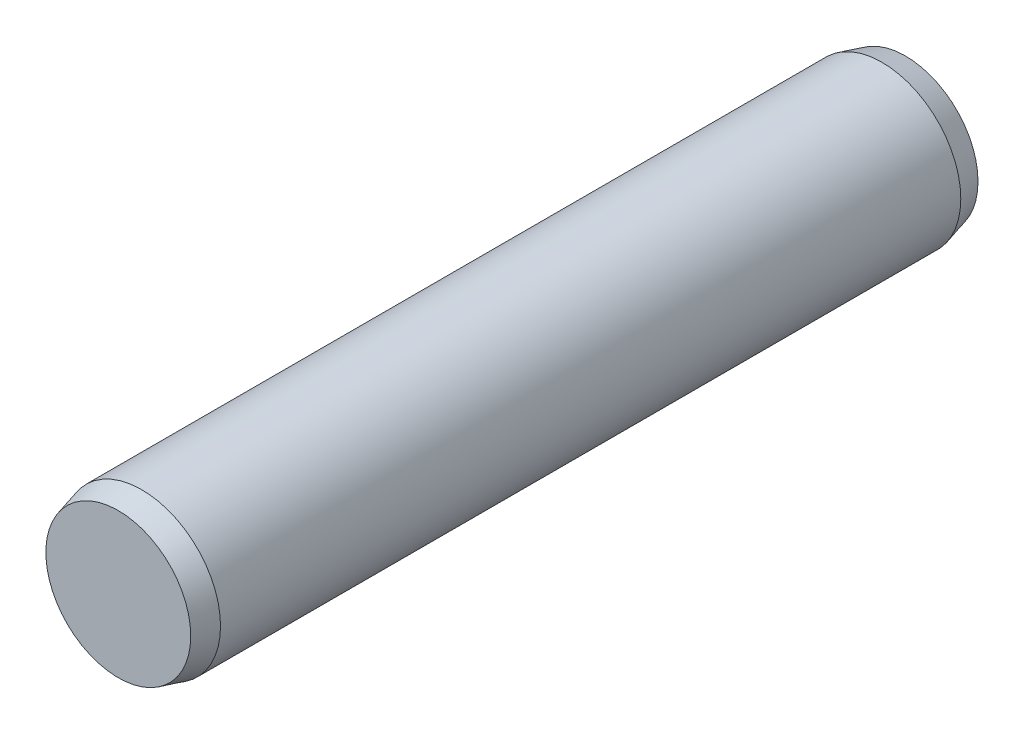
ISO-10303-21;
HEADER;
FILE_DESCRIPTION(('STEP AP214'),'2;1');
FILE_NAME('part.step','',(''),(''),'','','');
FILE_SCHEMA(('AUTOMOTIVE_DESIGN { 1 0 10303 214 1 1 1 1 }'));
ENDSEC;
DATA;
#1=APPLICATION_CONTEXT('core data for automotive mechanical design processes');
#2=APPLICATION_PROTOCOL_DEFINITION('international standard','automotive_design',2000,#1);
#3=PRODUCT_CONTEXT('',#1,'mechanical');
#4=PRODUCT('Part','Part','',(#3));
#5=PRODUCT_RELATED_PRODUCT_CATEGORY('part','',(#4));
#6=PRODUCT_DEFINITION_FORMATION('','',#4);
#7=PRODUCT_DEFINITION_CONTEXT('part definition',#1,'design');
#8=PRODUCT_DEFINITION('design','',#6,#7);
#9=PRODUCT_DEFINITION_SHAPE('','',#8);
#10=(LENGTH_UNIT() NAMED_UNIT(*) SI_UNIT(.MILLI.,.METRE.));
#11=(NAMED_UNIT(*) PLANE_ANGLE_UNIT() SI_UNIT($,.RADIAN.));
#12=(NAMED_UNIT(*) SI_UNIT($,.STERADIAN.) SOLID_ANGLE_UNIT());
#13=UNCERTAINTY_MEASURE_WITH_UNIT(LENGTH_MEASURE(1.E-05),#10,'distance_accuracy_value','');
#14=(GEOMETRIC_REPRESENTATION_CONTEXT(3) GLOBAL_UNCERTAINTY_ASSIGNED_CONTEXT((#13)) GLOBAL_UNIT_ASSIGNED_CONTEXT((#10,
#11,#12)) REPRESENTATION_CONTEXT('',''));
#15=CARTESIAN_POINT('',(0.,0.,0.));
#16=DIRECTION('',(0.,0.,1.));
#17=DIRECTION('',(1.,0.,0.));
#18=AXIS2_PLACEMENT_3D('',#15,#16,#17);
#19=CARTESIAN_POINT('',(0.,0.,12.5));
#20=DIRECTION('',(0.,0.,-1.));
#21=DIRECTION('',(-1.,0.,0.));
#22=AXIS2_PLACEMENT_3D('',#19,#20,#21);
#23=CYLINDRICAL_SURFACE('',#22,2.5);
#24=CARTESIAN_POINT('',(0.,0.,-11.7535898384862));
#25=DIRECTION('',(0.,0.,1.));
#26=DIRECTION('',(1.,0.,0.));
#27=AXIS2_PLACEMENT_3D('',#24,#25,#26);
#28=CIRCLE('',#27,2.5);
#29=CARTESIAN_POINT('',(2.5,0.,-11.7535898384862));
#30=VERTEX_POINT('',#29);
#31=EDGE_CURVE('E40',#30,#30,#28,.T.);
#32=ORIENTED_EDGE('',*,*,#31,.T.);
#33=EDGE_LOOP('',(#32));
#34=FACE_BOUND('',#33,.T.);
#35=CARTESIAN_POINT('',(0.,0.,11.7535898384862));
#36=DIRECTION('',(0.,0.,1.));
#37=DIRECTION('',(1.,0.,0.));
#38=AXIS2_PLACEMENT_3D('',#35,#36,#37);
#39=CIRCLE('',#38,2.5);
#40=CARTESIAN_POINT('',(2.5,0.,11.7535898384862));
#41=VERTEX_POINT('',#40);
#42=EDGE_CURVE('E44',#41,#41,#39,.F.);
#43=ORIENTED_EDGE('',*,*,#42,.T.);
#44=EDGE_LOOP('',(#43));
#45=FACE_BOUND('',#44,.T.);
#46=ADVANCED_FACE('F32',(#34,#45),#23,.T.);
#47=CARTESIAN_POINT('',(0.,0.,12.5));
#48=DIRECTION('',(0.,0.,1.));
#49=DIRECTION('',(1.,0.,0.));
#50=AXIS2_PLACEMENT_3D('',#47,#48,#49);
#51=PLANE('',#50);
#52=CARTESIAN_POINT('',(0.,0.,12.5));
#53=DIRECTION('',(0.,0.,1.));
#54=DIRECTION('',(1.,0.,0.));
#55=AXIS2_PLACEMENT_3D('',#52,#53,#54);
#56=CIRCLE('',#55,2.3);
#57=CARTESIAN_POINT('',(2.3,0.,12.5));
#58=VERTEX_POINT('',#57);
#59=EDGE_CURVE('E48',#58,#58,#56,.T.);
#60=ORIENTED_EDGE('',*,*,#59,.T.);
#61=EDGE_LOOP('',(#60));
#62=FACE_BOUND('',#61,.T.);
#63=ADVANCED_FACE('F54',(#62),#51,.T.);
#64=CARTESIAN_POINT('',(0.,0.,-12.5));
#65=DIRECTION('',(0.,0.,1.));
#66=DIRECTION('',(1.,0.,0.));
#67=AXIS2_PLACEMENT_3D('',#64,#65,#66);
#68=PLANE('',#67);
#69=CARTESIAN_POINT('',(0.,0.,-12.5));
#70=DIRECTION('',(0.,0.,1.));
#71=DIRECTION('',(1.,0.,0.));
#72=AXIS2_PLACEMENT_3D('',#69,#70,#71);
#73=CIRCLE('',#72,2.29999999999999);
#74=CARTESIAN_POINT('',(2.29999999999999,0.,-12.5));
#75=VERTEX_POINT('',#74);
#76=EDGE_CURVE('E10',#75,#75,#73,.F.);
#77=ORIENTED_EDGE('',*,*,#76,.T.);
#78=EDGE_LOOP('',(#77));
#79=FACE_BOUND('',#78,.T.);
#80=ADVANCED_FACE('F58',(#79),#68,.F.);
#81=CARTESIAN_POINT('',(0.,0.,12.5));
#82=DIRECTION('',(0.,0.,-1.));
#83=DIRECTION('',(-1.,0.,0.));
#84=AXIS2_PLACEMENT_3D('',#81,#82,#83);
#85=CONICAL_SURFACE('',#84,2.3,0.261799387799147);
#86=ORIENTED_EDGE('',*,*,#42,.F.);
#87=EDGE_LOOP('',(#86));
#88=FACE_BOUND('',#87,.T.);
#89=ORIENTED_EDGE('',*,*,#59,.F.);
#90=EDGE_LOOP('',(#89));
#91=FACE_BOUND('',#90,.T.);
#92=ADVANCED_FACE('F56',(#88,#91),#85,.T.);
#93=CARTESIAN_POINT('',(0.,0.,-11.7535898384862));
#94=DIRECTION('',(0.,0.,1.));
#95=DIRECTION('',(1.,0.,0.));
#96=AXIS2_PLACEMENT_3D('',#93,#94,#95);
#97=CONICAL_SURFACE('',#96,2.5,0.261799387799148);
#98=ORIENTED_EDGE('',*,*,#76,.F.);
#99=EDGE_LOOP('',(#98));
#100=FACE_BOUND('',#99,.T.);
#101=ORIENTED_EDGE('',*,*,#31,.F.);
#102=EDGE_LOOP('',(#101));
#103=FACE_BOUND('',#102,.T.);
#104=ADVANCED_FACE('F35',(#100,#103),#97,.T.);
#105=CLOSED_SHELL('',(#46,#63,#80,#92,#104));
#106=MANIFOLD_SOLID_BREP('B2',#105);
#107=ADVANCED_BREP_SHAPE_REPRESENTATION('',(#18,#106),#14);
#108=SHAPE_DEFINITION_REPRESENTATION(#9,#107);
ENDSEC;
END-ISO-10303-21;
